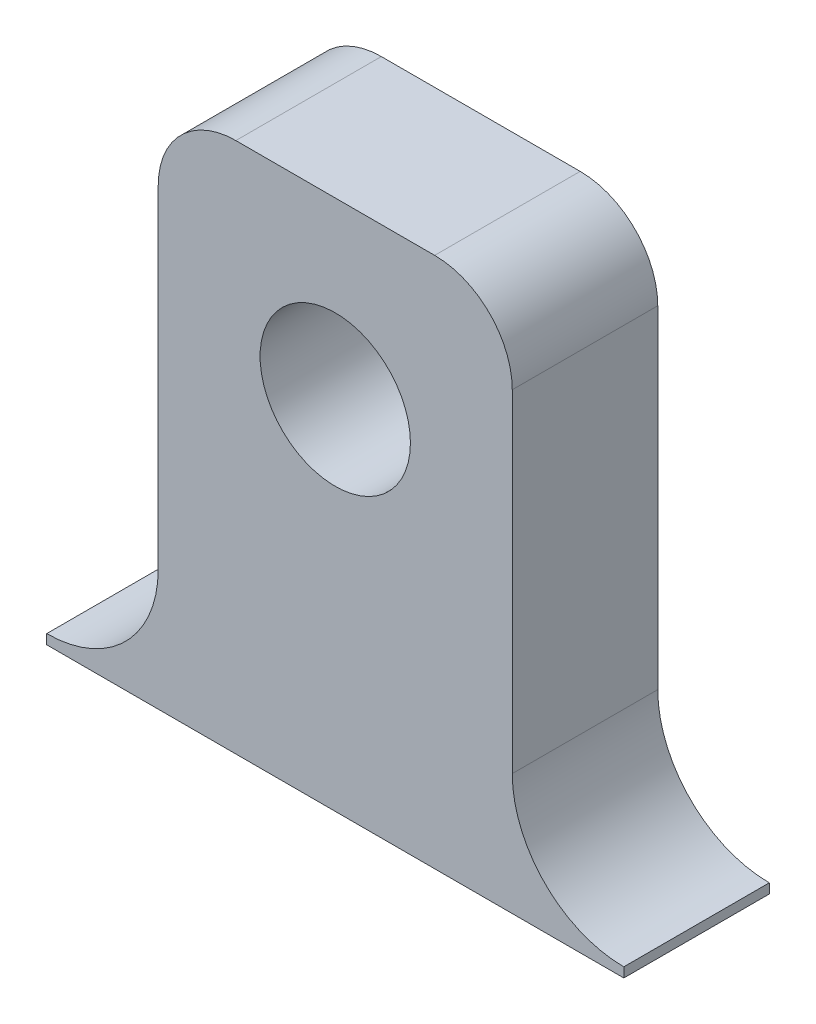
ISO-10303-21;
HEADER;
FILE_DESCRIPTION(('STEP AP214'),'2;1');
FILE_NAME('part.step','',(''),(''),'','','');
FILE_SCHEMA(('AUTOMOTIVE_DESIGN { 1 0 10303 214 1 1 1 1 }'));
ENDSEC;
DATA;
#1=APPLICATION_CONTEXT('core data for automotive mechanical design processes');
#2=APPLICATION_PROTOCOL_DEFINITION('international standard','automotive_design',2000,#1);
#3=PRODUCT_CONTEXT('',#1,'mechanical');
#4=PRODUCT('Part','Part','',(#3));
#5=PRODUCT_RELATED_PRODUCT_CATEGORY('part','',(#4));
#6=PRODUCT_DEFINITION_FORMATION('','',#4);
#7=PRODUCT_DEFINITION_CONTEXT('part definition',#1,'design');
#8=PRODUCT_DEFINITION('design','',#6,#7);
#9=PRODUCT_DEFINITION_SHAPE('','',#8);
#10=(LENGTH_UNIT() NAMED_UNIT(*) SI_UNIT(.MILLI.,.METRE.));
#11=(NAMED_UNIT(*) PLANE_ANGLE_UNIT() SI_UNIT($,.RADIAN.));
#12=(NAMED_UNIT(*) SI_UNIT($,.STERADIAN.) SOLID_ANGLE_UNIT());
#13=UNCERTAINTY_MEASURE_WITH_UNIT(LENGTH_MEASURE(1.E-05),#10,'distance_accuracy_value','');
#14=(GEOMETRIC_REPRESENTATION_CONTEXT(3) GLOBAL_UNCERTAINTY_ASSIGNED_CONTEXT((#13)) GLOBAL_UNIT_ASSIGNED_CONTEXT((#10,
#11,#12)) REPRESENTATION_CONTEXT('',''));
#15=CARTESIAN_POINT('',(0.,0.,0.));
#16=DIRECTION('',(0.,0.,1.));
#17=DIRECTION('',(1.,0.,0.));
#18=AXIS2_PLACEMENT_3D('',#15,#16,#17);
#19=CARTESIAN_POINT('',(-3.65,0.,3.));
#20=DIRECTION('',(1.,0.,0.));
#21=DIRECTION('',(0.,1.,0.));
#22=AXIS2_PLACEMENT_3D('',#19,#20,#21);
#23=PLANE('',#22);
#24=DIRECTION('',(0.,-1.,0.));
#25=VECTOR('',#24,1.);
#26=CARTESIAN_POINT('',(-3.65,0.,0.));
#27=LINE('',#26,#25);
#28=CARTESIAN_POINT('',(-3.65,7.,0.));
#29=VERTEX_POINT('',#28);
#30=CARTESIAN_POINT('',(-3.65,0.14569157471344,0.));
#31=VERTEX_POINT('',#30);
#32=EDGE_CURVE('E163',#29,#31,#27,.T.);
#33=ORIENTED_EDGE('',*,*,#32,.T.);
#34=DIRECTION('',(0.,0.,-1.));
#35=VECTOR('',#34,1.);
#36=CARTESIAN_POINT('',(-3.65,0.14569157471344,3.));
#37=LINE('',#36,#35);
#38=CARTESIAN_POINT('',(-3.65,0.14569157471344,3.));
#39=VERTEX_POINT('',#38);
#40=EDGE_CURVE('E11',#39,#31,#37,.T.);
#41=ORIENTED_EDGE('',*,*,#40,.F.);
#42=DIRECTION('',(0.,-1.,0.));
#43=VECTOR('',#42,1.);
#44=CARTESIAN_POINT('',(-3.65,0.,3.));
#45=LINE('',#44,#43);
#46=CARTESIAN_POINT('',(-3.65,7.,3.));
#47=VERTEX_POINT('',#46);
#48=EDGE_CURVE('E254',#47,#39,#45,.T.);
#49=ORIENTED_EDGE('',*,*,#48,.F.);
#50=DIRECTION('',(0.,0.,-1.));
#51=VECTOR('',#50,1.);
#52=CARTESIAN_POINT('',(-3.65,7.,3.));
#53=LINE('',#52,#51);
#54=EDGE_CURVE('E155',#47,#29,#53,.T.);
#55=ORIENTED_EDGE('',*,*,#54,.T.);
#56=EDGE_LOOP('',(#33,#41,#49,#55));
#57=FACE_BOUND('',#56,.T.);
#58=ADVANCED_FACE('F45',(#57),#23,.F.);
#59=CARTESIAN_POINT('',(-5.95,0.145691574713424,3.));
#60=DIRECTION('',(0.,0.,-1.));
#61=DIRECTION('',(-1.,0.,0.));
#62=AXIS2_PLACEMENT_3D('',#59,#60,#61);
#63=CYLINDRICAL_SURFACE('',#62,2.3);
#64=CARTESIAN_POINT('',(-5.95,0.145691574713424,0.));
#65=DIRECTION('',(0.,0.,1.));
#66=DIRECTION('',(1.,0.,0.));
#67=AXIS2_PLACEMENT_3D('',#64,#65,#66);
#68=CIRCLE('',#67,2.3);
#69=CARTESIAN_POINT('',(-5.95000000000001,-2.15430842528658,0.));
#70=VERTEX_POINT('',#69);
#71=EDGE_CURVE('E167',#31,#70,#68,.F.);
#72=ORIENTED_EDGE('',*,*,#71,.T.);
#73=DIRECTION('',(0.,0.,-1.));
#74=VECTOR('',#73,1.);
#75=CARTESIAN_POINT('',(-5.95000000000001,-2.15430842528658,3.));
#76=LINE('',#75,#74);
#77=CARTESIAN_POINT('',(-5.95000000000001,-2.15430842528658,3.));
#78=VERTEX_POINT('',#77);
#79=EDGE_CURVE('E55',#78,#70,#76,.T.);
#80=ORIENTED_EDGE('',*,*,#79,.F.);
#81=CARTESIAN_POINT('',(-5.95,0.145691574713424,3.));
#82=DIRECTION('',(0.,0.,1.));
#83=DIRECTION('',(1.,0.,0.));
#84=AXIS2_PLACEMENT_3D('',#81,#82,#83);
#85=CIRCLE('',#84,2.3);
#86=EDGE_CURVE('E112',#39,#78,#85,.F.);
#87=ORIENTED_EDGE('',*,*,#86,.F.);
#88=ORIENTED_EDGE('',*,*,#40,.T.);
#89=EDGE_LOOP('',(#72,#80,#87,#88));
#90=FACE_BOUND('',#89,.T.);
#91=ADVANCED_FACE('F268',(#90),#63,.F.);
#92=CARTESIAN_POINT('',(-5.95000000000018,-4.64472210692798E-13,3.));
#93=DIRECTION('',(1.,0.,0.));
#94=DIRECTION('',(0.,1.,0.));
#95=AXIS2_PLACEMENT_3D('',#92,#93,#94);
#96=PLANE('',#95);
#97=DIRECTION('',(0.,-1.,0.));
#98=VECTOR('',#97,1.);
#99=CARTESIAN_POINT('',(-5.95000000000018,-4.64472210692798E-13,0.));
#100=LINE('',#99,#98);
#101=CARTESIAN_POINT('',(-5.95,-2.35430842528658,0.));
#102=VERTEX_POINT('',#101);
#103=EDGE_CURVE('E170',#70,#102,#100,.T.);
#104=ORIENTED_EDGE('',*,*,#103,.T.);
#105=DIRECTION('',(0.,0.,-1.));
#106=VECTOR('',#105,1.);
#107=CARTESIAN_POINT('',(-5.95,-2.35430842528658,3.));
#108=LINE('',#107,#106);
#109=CARTESIAN_POINT('',(-5.95,-2.35430842528658,3.));
#110=VERTEX_POINT('',#109);
#111=EDGE_CURVE('E212',#110,#102,#108,.T.);
#112=ORIENTED_EDGE('',*,*,#111,.F.);
#113=DIRECTION('',(0.,-1.,0.));
#114=VECTOR('',#113,1.);
#115=CARTESIAN_POINT('',(-5.95000000000018,-4.64472210692798E-13,3.));
#116=LINE('',#115,#114);
#117=EDGE_CURVE('E221',#78,#110,#116,.T.);
#118=ORIENTED_EDGE('',*,*,#117,.F.);
#119=ORIENTED_EDGE('',*,*,#79,.T.);
#120=EDGE_LOOP('',(#104,#112,#118,#119));
#121=FACE_BOUND('',#120,.T.);
#122=ADVANCED_FACE('F219',(#121),#96,.F.);
#123=CARTESIAN_POINT('',(0.,-2.35430842528658,3.));
#124=DIRECTION('',(0.,-1.,0.));
#125=DIRECTION('',(1.,0.,0.));
#126=AXIS2_PLACEMENT_3D('',#123,#124,#125);
#127=PLANE('',#126);
#128=DIRECTION('',(-1.,0.,0.));
#129=VECTOR('',#128,1.);
#130=CARTESIAN_POINT('',(0.,-2.35430842528658,0.));
#131=LINE('',#130,#129);
#132=CARTESIAN_POINT('',(5.95000000000002,-2.35430842528658,0.));
#133=VERTEX_POINT('',#132);
#134=EDGE_CURVE('E174',#133,#102,#131,.T.);
#135=ORIENTED_EDGE('',*,*,#134,.F.);
#136=DIRECTION('',(0.,0.,-1.));
#137=VECTOR('',#136,1.);
#138=CARTESIAN_POINT('',(5.95000000000002,-2.35430842528658,3.));
#139=LINE('',#138,#137);
#140=CARTESIAN_POINT('',(5.95000000000002,-2.35430842528658,3.));
#141=VERTEX_POINT('',#140);
#142=EDGE_CURVE('E209',#141,#133,#139,.T.);
#143=ORIENTED_EDGE('',*,*,#142,.F.);
#144=DIRECTION('',(-1.,0.,0.));
#145=VECTOR('',#144,1.);
#146=CARTESIAN_POINT('',(0.,-2.35430842528658,3.));
#147=LINE('',#146,#145);
#148=EDGE_CURVE('E231',#141,#110,#147,.T.);
#149=ORIENTED_EDGE('',*,*,#148,.T.);
#150=ORIENTED_EDGE('',*,*,#111,.T.);
#151=EDGE_LOOP('',(#135,#143,#149,#150));
#152=FACE_BOUND('',#151,.T.);
#153=ADVANCED_FACE('F228',(#152),#127,.T.);
#154=CARTESIAN_POINT('',(5.94999999999998,1.03216046820619E-13,3.));
#155=DIRECTION('',(1.,0.,0.));
#156=DIRECTION('',(0.,1.,0.));
#157=AXIS2_PLACEMENT_3D('',#154,#155,#156);
#158=PLANE('',#157);
#159=DIRECTION('',(0.,-1.,0.));
#160=VECTOR('',#159,1.);
#161=CARTESIAN_POINT('',(5.94999999999998,1.03216046820619E-13,0.));
#162=LINE('',#161,#160);
#163=CARTESIAN_POINT('',(5.95000000000002,-2.15430842528658,0.));
#164=VERTEX_POINT('',#163);
#165=EDGE_CURVE('E178',#164,#133,#162,.T.);
#166=ORIENTED_EDGE('',*,*,#165,.F.);
#167=DIRECTION('',(0.,0.,-1.));
#168=VECTOR('',#167,1.);
#169=CARTESIAN_POINT('',(5.95000000000002,-2.15430842528658,3.));
#170=LINE('',#169,#168);
#171=CARTESIAN_POINT('',(5.95000000000002,-2.15430842528658,3.));
#172=VERTEX_POINT('',#171);
#173=EDGE_CURVE('E206',#172,#164,#170,.T.);
#174=ORIENTED_EDGE('',*,*,#173,.F.);
#175=DIRECTION('',(0.,-1.,0.));
#176=VECTOR('',#175,1.);
#177=CARTESIAN_POINT('',(5.94999999999998,1.03216046820619E-13,3.));
#178=LINE('',#177,#176);
#179=EDGE_CURVE('E235',#172,#141,#178,.T.);
#180=ORIENTED_EDGE('',*,*,#179,.T.);
#181=ORIENTED_EDGE('',*,*,#142,.T.);
#182=EDGE_LOOP('',(#166,#174,#180,#181));
#183=FACE_BOUND('',#182,.T.);
#184=ADVANCED_FACE('F278',(#183),#158,.T.);
#185=CARTESIAN_POINT('',(5.95,0.145691574713424,3.));
#186=DIRECTION('',(0.,0.,-1.));
#187=DIRECTION('',(-1.,0.,0.));
#188=AXIS2_PLACEMENT_3D('',#185,#186,#187);
#189=CYLINDRICAL_SURFACE('',#188,2.3);
#190=CARTESIAN_POINT('',(5.95,0.145691574713424,0.));
#191=DIRECTION('',(0.,0.,1.));
#192=DIRECTION('',(1.,0.,0.));
#193=AXIS2_PLACEMENT_3D('',#190,#191,#192);
#194=CIRCLE('',#193,2.3);
#195=CARTESIAN_POINT('',(3.65,0.145691574713442,0.));
#196=VERTEX_POINT('',#195);
#197=EDGE_CURVE('E182',#196,#164,#194,.T.);
#198=ORIENTED_EDGE('',*,*,#197,.F.);
#199=DIRECTION('',(0.,0.,-1.));
#200=VECTOR('',#199,1.);
#201=CARTESIAN_POINT('',(3.65,0.145691574713442,3.));
#202=LINE('',#201,#200);
#203=CARTESIAN_POINT('',(3.65,0.145691574713442,3.));
#204=VERTEX_POINT('',#203);
#205=EDGE_CURVE('E203',#204,#196,#202,.T.);
#206=ORIENTED_EDGE('',*,*,#205,.F.);
#207=CARTESIAN_POINT('',(5.95,0.145691574713424,3.));
#208=DIRECTION('',(0.,0.,1.));
#209=DIRECTION('',(1.,0.,0.));
#210=AXIS2_PLACEMENT_3D('',#207,#208,#209);
#211=CIRCLE('',#210,2.3);
#212=EDGE_CURVE('E239',#204,#172,#211,.T.);
#213=ORIENTED_EDGE('',*,*,#212,.T.);
#214=ORIENTED_EDGE('',*,*,#173,.T.);
#215=EDGE_LOOP('',(#198,#206,#213,#214));
#216=FACE_BOUND('',#215,.T.);
#217=ADVANCED_FACE('F281',(#216),#189,.F.);
#218=CARTESIAN_POINT('',(3.65,0.,3.));
#219=DIRECTION('',(1.,0.,0.));
#220=DIRECTION('',(0.,0.,-1.));
#221=AXIS2_PLACEMENT_3D('',#218,#219,#220);
#222=PLANE('',#221);
#223=DIRECTION('',(0.,-1.,0.));
#224=VECTOR('',#223,1.);
#225=CARTESIAN_POINT('',(3.65,0.,0.));
#226=LINE('',#225,#224);
#227=CARTESIAN_POINT('',(3.65,7.,0.));
#228=VERTEX_POINT('',#227);
#229=EDGE_CURVE('E186',#228,#196,#226,.T.);
#230=ORIENTED_EDGE('',*,*,#229,.F.);
#231=DIRECTION('',(0.,0.,-1.));
#232=VECTOR('',#231,1.);
#233=CARTESIAN_POINT('',(3.65,7.,3.));
#234=LINE('',#233,#232);
#235=CARTESIAN_POINT('',(3.65,7.,3.));
#236=VERTEX_POINT('',#235);
#237=EDGE_CURVE('E148',#236,#228,#234,.T.);
#238=ORIENTED_EDGE('',*,*,#237,.F.);
#239=DIRECTION('',(0.,-1.,0.));
#240=VECTOR('',#239,1.);
#241=CARTESIAN_POINT('',(3.65,0.,3.));
#242=LINE('',#241,#240);
#243=EDGE_CURVE('E139',#236,#204,#242,.T.);
#244=ORIENTED_EDGE('',*,*,#243,.T.);
#245=ORIENTED_EDGE('',*,*,#205,.T.);
#246=EDGE_LOOP('',(#230,#238,#244,#245));
#247=FACE_BOUND('',#246,.T.);
#248=ADVANCED_FACE('F249',(#247),#222,.T.);
#249=CARTESIAN_POINT('',(2.05,7.,3.));
#250=DIRECTION('',(0.,0.,-1.));
#251=DIRECTION('',(-1.,0.,0.));
#252=AXIS2_PLACEMENT_3D('',#249,#250,#251);
#253=CYLINDRICAL_SURFACE('',#252,1.6);
#254=CARTESIAN_POINT('',(2.05,7.,0.));
#255=DIRECTION('',(0.,0.,1.));
#256=DIRECTION('',(1.,0.,0.));
#257=AXIS2_PLACEMENT_3D('',#254,#255,#256);
#258=CIRCLE('',#257,1.6);
#259=CARTESIAN_POINT('',(2.05,8.6,0.));
#260=VERTEX_POINT('',#259);
#261=EDGE_CURVE('E146',#228,#260,#258,.T.);
#262=ORIENTED_EDGE('',*,*,#261,.T.);
#263=DIRECTION('',(0.,0.,-1.));
#264=VECTOR('',#263,1.);
#265=CARTESIAN_POINT('',(2.05,8.6,3.));
#266=LINE('',#265,#264);
#267=CARTESIAN_POINT('',(2.05,8.6,3.));
#268=VERTEX_POINT('',#267);
#269=EDGE_CURVE('E143',#268,#260,#266,.T.);
#270=ORIENTED_EDGE('',*,*,#269,.F.);
#271=CARTESIAN_POINT('',(2.05,7.,3.));
#272=DIRECTION('',(0.,0.,1.));
#273=DIRECTION('',(1.,0.,0.));
#274=AXIS2_PLACEMENT_3D('',#271,#272,#273);
#275=CIRCLE('',#274,1.6);
#276=EDGE_CURVE('E132',#236,#268,#275,.T.);
#277=ORIENTED_EDGE('',*,*,#276,.F.);
#278=ORIENTED_EDGE('',*,*,#237,.T.);
#279=EDGE_LOOP('',(#262,#270,#277,#278));
#280=FACE_BOUND('',#279,.T.);
#281=ADVANCED_FACE('F144',(#280),#253,.T.);
#282=CARTESIAN_POINT('',(0.,8.6,3.));
#283=DIRECTION('',(0.,-1.,0.));
#284=DIRECTION('',(1.,0.,0.));
#285=AXIS2_PLACEMENT_3D('',#282,#283,#284);
#286=PLANE('',#285);
#287=DIRECTION('',(-1.,0.,0.));
#288=VECTOR('',#287,1.);
#289=CARTESIAN_POINT('',(0.,8.6,0.));
#290=LINE('',#289,#288);
#291=CARTESIAN_POINT('',(-2.05,8.6,0.));
#292=VERTEX_POINT('',#291);
#293=EDGE_CURVE('E98',#260,#292,#290,.T.);
#294=ORIENTED_EDGE('',*,*,#293,.T.);
#295=DIRECTION('',(0.,0.,-1.));
#296=VECTOR('',#295,1.);
#297=CARTESIAN_POINT('',(-2.05,8.6,3.));
#298=LINE('',#297,#296);
#299=CARTESIAN_POINT('',(-2.05,8.6,3.));
#300=VERTEX_POINT('',#299);
#301=EDGE_CURVE('E149',#300,#292,#298,.T.);
#302=ORIENTED_EDGE('',*,*,#301,.F.);
#303=DIRECTION('',(-1.,0.,0.));
#304=VECTOR('',#303,1.);
#305=CARTESIAN_POINT('',(0.,8.6,3.));
#306=LINE('',#305,#304);
#307=EDGE_CURVE('E136',#268,#300,#306,.T.);
#308=ORIENTED_EDGE('',*,*,#307,.F.);
#309=ORIENTED_EDGE('',*,*,#269,.T.);
#310=EDGE_LOOP('',(#294,#302,#308,#309));
#311=FACE_BOUND('',#310,.T.);
#312=ADVANCED_FACE('F151',(#311),#286,.F.);
#313=CARTESIAN_POINT('',(0.,5.,3.));
#314=DIRECTION('',(0.,0.,-1.));
#315=DIRECTION('',(-1.,0.,0.));
#316=AXIS2_PLACEMENT_3D('',#313,#314,#315);
#317=CYLINDRICAL_SURFACE('',#316,1.55);
#318=CARTESIAN_POINT('',(0.,5.,3.));
#319=DIRECTION('',(0.,0.,1.));
#320=DIRECTION('',(1.,0.,0.));
#321=AXIS2_PLACEMENT_3D('',#318,#319,#320);
#322=CIRCLE('',#321,1.55);
#323=CARTESIAN_POINT('',(1.55,5.,3.));
#324=VERTEX_POINT('',#323);
#325=EDGE_CURVE('E196',#324,#324,#322,.T.);
#326=ORIENTED_EDGE('',*,*,#325,.T.);
#327=EDGE_LOOP('',(#326));
#328=FACE_BOUND('',#327,.T.);
#329=CARTESIAN_POINT('',(0.,5.,0.));
#330=DIRECTION('',(0.,0.,1.));
#331=DIRECTION('',(1.,0.,0.));
#332=AXIS2_PLACEMENT_3D('',#329,#330,#331);
#333=CIRCLE('',#332,1.55);
#334=CARTESIAN_POINT('',(1.55,5.,0.));
#335=VERTEX_POINT('',#334);
#336=EDGE_CURVE('E159',#335,#335,#333,.T.);
#337=ORIENTED_EDGE('',*,*,#336,.F.);
#338=EDGE_LOOP('',(#337));
#339=FACE_BOUND('',#338,.T.);
#340=ADVANCED_FACE('F47',(#328,#339),#317,.F.);
#341=CARTESIAN_POINT('',(-2.05,7.,3.));
#342=DIRECTION('',(0.,0.,-1.));
#343=DIRECTION('',(-1.,0.,0.));
#344=AXIS2_PLACEMENT_3D('',#341,#342,#343);
#345=CYLINDRICAL_SURFACE('',#344,1.6);
#346=CARTESIAN_POINT('',(-2.05,7.,0.));
#347=DIRECTION('',(0.,0.,1.));
#348=DIRECTION('',(1.,0.,0.));
#349=AXIS2_PLACEMENT_3D('',#346,#347,#348);
#350=CIRCLE('',#349,1.6);
#351=EDGE_CURVE('E104',#292,#29,#350,.T.);
#352=ORIENTED_EDGE('',*,*,#351,.T.);
#353=ORIENTED_EDGE('',*,*,#54,.F.);
#354=CARTESIAN_POINT('',(-2.05,7.,3.));
#355=DIRECTION('',(0.,0.,1.));
#356=DIRECTION('',(1.,0.,0.));
#357=AXIS2_PLACEMENT_3D('',#354,#355,#356);
#358=CIRCLE('',#357,1.6);
#359=EDGE_CURVE('E63',#300,#47,#358,.T.);
#360=ORIENTED_EDGE('',*,*,#359,.F.);
#361=ORIENTED_EDGE('',*,*,#301,.T.);
#362=EDGE_LOOP('',(#352,#353,#360,#361));
#363=FACE_BOUND('',#362,.T.);
#364=ADVANCED_FACE('F255',(#363),#345,.T.);
#365=CARTESIAN_POINT('',(0.,0.,3.));
#366=DIRECTION('',(0.,0.,1.));
#367=DIRECTION('',(1.,0.,0.));
#368=AXIS2_PLACEMENT_3D('',#365,#366,#367);
#369=PLANE('',#368);
#370=ORIENTED_EDGE('',*,*,#325,.F.);
#371=EDGE_LOOP('',(#370));
#372=FACE_BOUND('',#371,.T.);
#373=ORIENTED_EDGE('',*,*,#48,.T.);
#374=ORIENTED_EDGE('',*,*,#86,.T.);
#375=ORIENTED_EDGE('',*,*,#117,.T.);
#376=ORIENTED_EDGE('',*,*,#148,.F.);
#377=ORIENTED_EDGE('',*,*,#179,.F.);
#378=ORIENTED_EDGE('',*,*,#212,.F.);
#379=ORIENTED_EDGE('',*,*,#243,.F.);
#380=ORIENTED_EDGE('',*,*,#276,.T.);
#381=ORIENTED_EDGE('',*,*,#307,.T.);
#382=ORIENTED_EDGE('',*,*,#359,.T.);
#383=EDGE_LOOP('',(#373,#374,#375,#376,#377,#378,#379,#380,#381,#382));
#384=FACE_BOUND('',#383,.T.);
#385=ADVANCED_FACE('F134',(#372,#384),#369,.T.);
#386=CARTESIAN_POINT('',(0.,0.,0.));
#387=DIRECTION('',(0.,0.,1.));
#388=DIRECTION('',(1.,0.,0.));
#389=AXIS2_PLACEMENT_3D('',#386,#387,#388);
#390=PLANE('',#389);
#391=ORIENTED_EDGE('',*,*,#336,.T.);
#392=EDGE_LOOP('',(#391));
#393=FACE_BOUND('',#392,.T.);
#394=ORIENTED_EDGE('',*,*,#32,.F.);
#395=ORIENTED_EDGE('',*,*,#351,.F.);
#396=ORIENTED_EDGE('',*,*,#293,.F.);
#397=ORIENTED_EDGE('',*,*,#261,.F.);
#398=ORIENTED_EDGE('',*,*,#229,.T.);
#399=ORIENTED_EDGE('',*,*,#197,.T.);
#400=ORIENTED_EDGE('',*,*,#165,.T.);
#401=ORIENTED_EDGE('',*,*,#134,.T.);
#402=ORIENTED_EDGE('',*,*,#103,.F.);
#403=ORIENTED_EDGE('',*,*,#71,.F.);
#404=EDGE_LOOP('',(#394,#395,#396,#397,#398,#399,#400,#401,#402,#403));
#405=FACE_BOUND('',#404,.T.);
#406=ADVANCED_FACE('F224',(#393,#405),#390,.F.);
#407=CLOSED_SHELL('',(#58,#91,#122,#153,#184,#217,#248,#281,#312,#340,#364,#385,#406));
#408=MANIFOLD_SOLID_BREP('B2',#407);
#409=ADVANCED_BREP_SHAPE_REPRESENTATION('',(#18,#408),#14);
#410=SHAPE_DEFINITION_REPRESENTATION(#9,#409);
ENDSEC;
END-ISO-10303-21;
